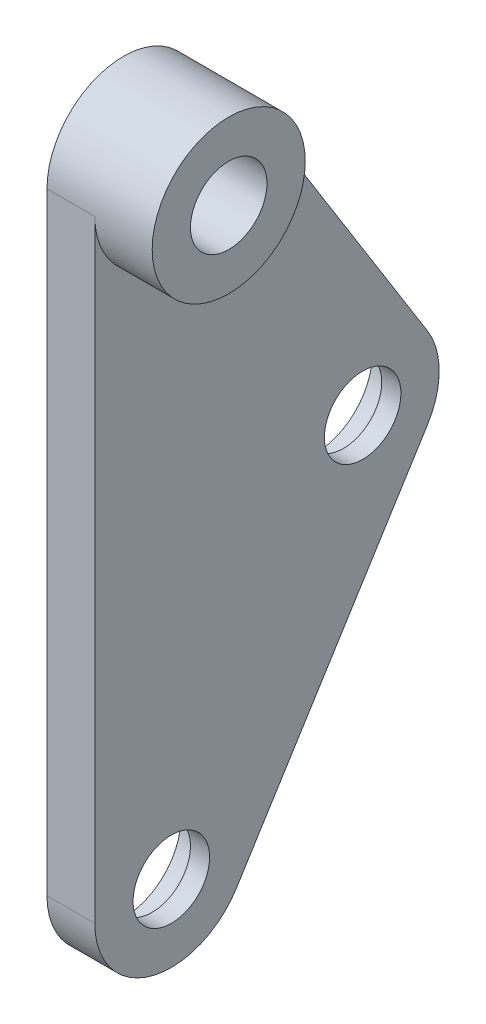
ISO-10303-21;
HEADER;
FILE_DESCRIPTION(('STEP AP214'),'2;1');
FILE_NAME('part.step','',(''),(''),'','','');
FILE_SCHEMA(('AUTOMOTIVE_DESIGN { 1 0 10303 214 1 1 1 1 }'));
ENDSEC;
DATA;
#1=APPLICATION_CONTEXT('core data for automotive mechanical design processes');
#2=APPLICATION_PROTOCOL_DEFINITION('international standard','automotive_design',2000,#1);
#3=PRODUCT_CONTEXT('',#1,'mechanical');
#4=PRODUCT('Part','Part','',(#3));
#5=PRODUCT_RELATED_PRODUCT_CATEGORY('part','',(#4));
#6=PRODUCT_DEFINITION_FORMATION('','',#4);
#7=PRODUCT_DEFINITION_CONTEXT('part definition',#1,'design');
#8=PRODUCT_DEFINITION('design','',#6,#7);
#9=PRODUCT_DEFINITION_SHAPE('','',#8);
#10=(LENGTH_UNIT() NAMED_UNIT(*) SI_UNIT(.MILLI.,.METRE.));
#11=(NAMED_UNIT(*) PLANE_ANGLE_UNIT() SI_UNIT($,.RADIAN.));
#12=(NAMED_UNIT(*) SI_UNIT($,.STERADIAN.) SOLID_ANGLE_UNIT());
#13=UNCERTAINTY_MEASURE_WITH_UNIT(LENGTH_MEASURE(1.E-05),#10,'distance_accuracy_value','');
#14=(GEOMETRIC_REPRESENTATION_CONTEXT(3) GLOBAL_UNCERTAINTY_ASSIGNED_CONTEXT((#13)) GLOBAL_UNIT_ASSIGNED_CONTEXT((#10,
#11,#12)) REPRESENTATION_CONTEXT('',''));
#15=CARTESIAN_POINT('',(0.,0.,0.));
#16=DIRECTION('',(0.,0.,1.));
#17=DIRECTION('',(1.,0.,0.));
#18=AXIS2_PLACEMENT_3D('',#15,#16,#17);
#19=CARTESIAN_POINT('',(5.5,-4.,-4.));
#20=DIRECTION('',(-1.,0.,0.));
#21=DIRECTION('',(0.,0.,1.));
#22=AXIS2_PLACEMENT_3D('',#19,#20,#21);
#23=CYLINDRICAL_SURFACE('',#22,2.);
#24=CARTESIAN_POINT('',(5.5,-4.,-4.));
#25=DIRECTION('',(1.,0.,0.));
#26=DIRECTION('',(0.,0.,-1.));
#27=AXIS2_PLACEMENT_3D('',#24,#25,#26);
#28=CIRCLE('',#27,2.);
#29=CARTESIAN_POINT('',(5.5,-4.,-6.));
#30=VERTEX_POINT('',#29);
#31=EDGE_CURVE('E233',#30,#30,#28,.T.);
#32=ORIENTED_EDGE('',*,*,#31,.T.);
#33=EDGE_LOOP('',(#32));
#34=FACE_BOUND('',#33,.T.);
#35=CARTESIAN_POINT('',(1.5,-4.,-4.));
#36=DIRECTION('',(-1.,0.,0.));
#37=DIRECTION('',(0.,0.,1.));
#38=AXIS2_PLACEMENT_3D('',#35,#36,#37);
#39=CIRCLE('',#38,2.);
#40=CARTESIAN_POINT('',(1.5,-4.,-2.));
#41=VERTEX_POINT('',#40);
#42=EDGE_CURVE('E108',#41,#41,#39,.T.);
#43=ORIENTED_EDGE('',*,*,#42,.T.);
#44=EDGE_LOOP('',(#43));
#45=FACE_BOUND('',#44,.T.);
#46=ADVANCED_FACE('F104',(#34,#45),#23,.F.);
#47=CARTESIAN_POINT('',(5.5,-36.,-4.));
#48=DIRECTION('',(-1.,0.,0.));
#49=DIRECTION('',(0.,0.,1.));
#50=AXIS2_PLACEMENT_3D('',#47,#48,#49);
#51=CYLINDRICAL_SURFACE('',#50,2.);
#52=CARTESIAN_POINT('',(2.5,-36.,-4.));
#53=DIRECTION('',(1.,0.,0.));
#54=DIRECTION('',(0.,0.,-1.));
#55=AXIS2_PLACEMENT_3D('',#52,#53,#54);
#56=CIRCLE('',#55,2.);
#57=CARTESIAN_POINT('',(2.5,-36.,-6.));
#58=VERTEX_POINT('',#57);
#59=EDGE_CURVE('E228',#58,#58,#56,.F.);
#60=ORIENTED_EDGE('',*,*,#59,.F.);
#61=EDGE_LOOP('',(#60));
#62=FACE_BOUND('',#61,.T.);
#63=CARTESIAN_POINT('',(1.5,-36.,-4.));
#64=DIRECTION('',(-1.,0.,0.));
#65=DIRECTION('',(0.,0.,1.));
#66=AXIS2_PLACEMENT_3D('',#63,#64,#65);
#67=CIRCLE('',#66,2.);
#68=CARTESIAN_POINT('',(1.5,-36.,-2.));
#69=VERTEX_POINT('',#68);
#70=EDGE_CURVE('E240',#69,#69,#67,.T.);
#71=ORIENTED_EDGE('',*,*,#70,.T.);
#72=EDGE_LOOP('',(#71));
#73=FACE_BOUND('',#72,.T.);
#74=ADVANCED_FACE('F279',(#62,#73),#51,.F.);
#75=CARTESIAN_POINT('',(5.5,-20.,-14.));
#76=DIRECTION('',(-1.,0.,0.));
#77=DIRECTION('',(0.,0.,1.));
#78=AXIS2_PLACEMENT_3D('',#75,#76,#77);
#79=CYLINDRICAL_SURFACE('',#78,2.);
#80=CARTESIAN_POINT('',(2.5,-20.,-14.));
#81=DIRECTION('',(1.,0.,0.));
#82=DIRECTION('',(0.,0.,-1.));
#83=AXIS2_PLACEMENT_3D('',#80,#81,#82);
#84=CIRCLE('',#83,2.);
#85=CARTESIAN_POINT('',(2.5,-20.,-16.));
#86=VERTEX_POINT('',#85);
#87=EDGE_CURVE('E232',#86,#86,#84,.F.);
#88=ORIENTED_EDGE('',*,*,#87,.F.);
#89=EDGE_LOOP('',(#88));
#90=FACE_BOUND('',#89,.T.);
#91=CARTESIAN_POINT('',(1.5,-20.,-14.));
#92=DIRECTION('',(-1.,0.,0.));
#93=DIRECTION('',(0.,0.,1.));
#94=AXIS2_PLACEMENT_3D('',#91,#92,#93);
#95=CIRCLE('',#94,2.);
#96=CARTESIAN_POINT('',(1.5,-20.,-12.));
#97=VERTEX_POINT('',#96);
#98=EDGE_CURVE('E237',#97,#97,#95,.T.);
#99=ORIENTED_EDGE('',*,*,#98,.T.);
#100=EDGE_LOOP('',(#99));
#101=FACE_BOUND('',#100,.T.);
#102=ADVANCED_FACE('F284',(#90,#101),#79,.F.);
#103=CARTESIAN_POINT('',(2.5,2.79415306338351,-4.47064490141361));
#104=DIRECTION('',(0.,0.52999894000318,-0.847998304005088));
#105=DIRECTION('',(0.,0.847998304005088,0.52999894000318));
#106=AXIS2_PLACEMENT_3D('',#103,#104,#105);
#107=PLANE('',#106);
#108=DIRECTION('',(0.,-0.847998304005088,-0.52999894000318));
#109=VECTOR('',#108,1.);
#110=CARTESIAN_POINT('',(0.,2.79415306338351,-4.47064490141361));
#111=LINE('',#110,#109);
#112=CARTESIAN_POINT('',(0.,-1.88000423998728,-7.39199321602035));
#113=VERTEX_POINT('',#112);
#114=CARTESIAN_POINT('',(0.,-17.8800042399873,-17.3919932160204));
#115=VERTEX_POINT('',#114);
#116=EDGE_CURVE('E196',#113,#115,#111,.T.);
#117=ORIENTED_EDGE('',*,*,#116,.F.);
#118=DIRECTION('',(-1.,0.,0.));
#119=VECTOR('',#118,1.);
#120=CARTESIAN_POINT('',(2.5,-1.88000423998728,-7.39199321602035));
#121=LINE('',#120,#119);
#122=CARTESIAN_POINT('',(2.5,-1.88000423998728,-7.39199321602035));
#123=VERTEX_POINT('',#122);
#124=EDGE_CURVE('E212',#123,#113,#121,.T.);
#125=ORIENTED_EDGE('',*,*,#124,.F.);
#126=DIRECTION('',(0.,-0.847998304005088,-0.52999894000318));
#127=VECTOR('',#126,1.);
#128=CARTESIAN_POINT('',(2.5,2.79415306338351,-4.47064490141361));
#129=LINE('',#128,#127);
#130=CARTESIAN_POINT('',(2.5,-17.8800042399873,-17.3919932160204));
#131=VERTEX_POINT('',#130);
#132=EDGE_CURVE('E187',#123,#131,#129,.T.);
#133=ORIENTED_EDGE('',*,*,#132,.T.);
#134=DIRECTION('',(-1.,0.,0.));
#135=VECTOR('',#134,1.);
#136=CARTESIAN_POINT('',(2.5,-17.8800042399873,-17.3919932160204));
#137=LINE('',#136,#135);
#138=EDGE_CURVE('E115',#131,#115,#137,.T.);
#139=ORIENTED_EDGE('',*,*,#138,.T.);
#140=EDGE_LOOP('',(#117,#125,#133,#139));
#141=FACE_BOUND('',#140,.T.);
#142=ADVANCED_FACE('F292',(#141),#107,.T.);
#143=CARTESIAN_POINT('',(2.5,0.,0.));
#144=DIRECTION('',(0.,0.,-1.));
#145=DIRECTION('',(-1.,0.,0.));
#146=AXIS2_PLACEMENT_3D('',#143,#144,#145);
#147=PLANE('',#146);
#148=DIRECTION('',(0.,-1.,0.));
#149=VECTOR('',#148,1.);
#150=CARTESIAN_POINT('',(0.,0.,0.));
#151=LINE('',#150,#149);
#152=CARTESIAN_POINT('',(0.,-4.,0.));
#153=VERTEX_POINT('',#152);
#154=CARTESIAN_POINT('',(0.,-36.,0.));
#155=VERTEX_POINT('',#154);
#156=EDGE_CURVE('E168',#153,#155,#151,.T.);
#157=ORIENTED_EDGE('',*,*,#156,.T.);
#158=DIRECTION('',(-1.,0.,0.));
#159=VECTOR('',#158,1.);
#160=CARTESIAN_POINT('',(2.5,-36.,0.));
#161=LINE('',#160,#159);
#162=CARTESIAN_POINT('',(2.5,-36.,0.));
#163=VERTEX_POINT('',#162);
#164=EDGE_CURVE('E162',#163,#155,#161,.T.);
#165=ORIENTED_EDGE('',*,*,#164,.F.);
#166=DIRECTION('',(0.,-1.,0.));
#167=VECTOR('',#166,1.);
#168=CARTESIAN_POINT('',(2.5,0.,0.));
#169=LINE('',#168,#167);
#170=CARTESIAN_POINT('',(2.5,-4.,0.));
#171=VERTEX_POINT('',#170);
#172=EDGE_CURVE('E166',#171,#163,#169,.T.);
#173=ORIENTED_EDGE('',*,*,#172,.F.);
#174=DIRECTION('',(-1.,0.,0.));
#175=VECTOR('',#174,1.);
#176=CARTESIAN_POINT('',(2.5,-4.,0.));
#177=LINE('',#176,#175);
#178=EDGE_CURVE('E172',#171,#153,#177,.T.);
#179=ORIENTED_EDGE('',*,*,#178,.T.);
#180=EDGE_LOOP('',(#157,#165,#173,#179));
#181=FACE_BOUND('',#180,.T.);
#182=ADVANCED_FACE('F164',(#181),#147,.F.);
#183=CARTESIAN_POINT('',(2.5,-14.0301081195633,-22.4481729913013));
#184=DIRECTION('',(0.,-0.52999894000318,-0.847998304005088));
#185=DIRECTION('',(0.,0.847998304005088,-0.52999894000318));
#186=AXIS2_PLACEMENT_3D('',#183,#184,#185);
#187=PLANE('',#186);
#188=DIRECTION('',(0.,-0.847998304005088,0.52999894000318));
#189=VECTOR('',#188,1.);
#190=CARTESIAN_POINT('',(0.,-14.0301081195633,-22.4481729913013));
#191=LINE('',#190,#189);
#192=CARTESIAN_POINT('',(0.,-22.1199957600127,-17.3919932160204));
#193=VERTEX_POINT('',#192);
#194=CARTESIAN_POINT('',(0.,-38.1199957600127,-7.39199321602035));
#195=VERTEX_POINT('',#194);
#196=EDGE_CURVE('E193',#193,#195,#191,.T.);
#197=ORIENTED_EDGE('',*,*,#196,.F.);
#198=DIRECTION('',(-1.,0.,0.));
#199=VECTOR('',#198,1.);
#200=CARTESIAN_POINT('',(2.5,-22.1199957600127,-17.3919932160204));
#201=LINE('',#200,#199);
#202=CARTESIAN_POINT('',(2.5,-22.1199957600127,-17.3919932160204));
#203=VERTEX_POINT('',#202);
#204=EDGE_CURVE('E124',#203,#193,#201,.T.);
#205=ORIENTED_EDGE('',*,*,#204,.F.);
#206=DIRECTION('',(0.,-0.847998304005088,0.52999894000318));
#207=VECTOR('',#206,1.);
#208=CARTESIAN_POINT('',(2.5,-14.0301081195633,-22.4481729913013));
#209=LINE('',#208,#207);
#210=CARTESIAN_POINT('',(2.5,-38.1199957600127,-7.39199321602035));
#211=VERTEX_POINT('',#210);
#212=EDGE_CURVE('E186',#203,#211,#209,.T.);
#213=ORIENTED_EDGE('',*,*,#212,.T.);
#214=DIRECTION('',(-1.,0.,0.));
#215=VECTOR('',#214,1.);
#216=CARTESIAN_POINT('',(2.5,-38.1199957600127,-7.39199321602035));
#217=LINE('',#216,#215);
#218=EDGE_CURVE('E145',#211,#195,#217,.T.);
#219=ORIENTED_EDGE('',*,*,#218,.T.);
#220=EDGE_LOOP('',(#197,#205,#213,#219));
#221=FACE_BOUND('',#220,.T.);
#222=ADVANCED_FACE('F301',(#221),#187,.T.);
#223=CARTESIAN_POINT('',(0.,0.,0.));
#224=DIRECTION('',(1.,0.,0.));
#225=DIRECTION('',(0.,0.,-1.));
#226=AXIS2_PLACEMENT_3D('',#223,#224,#225);
#227=PLANE('',#226);
#228=CARTESIAN_POINT('',(0.,-4.,-4.));
#229=DIRECTION('',(-1.,0.,0.));
#230=DIRECTION('',(0.,0.,1.));
#231=AXIS2_PLACEMENT_3D('',#228,#229,#230);
#232=CIRCLE('',#231,3.);
#233=CARTESIAN_POINT('',(0.,-4.,-1.));
#234=VERTEX_POINT('',#233);
#235=EDGE_CURVE('E433',#234,#234,#232,.T.);
#236=ORIENTED_EDGE('',*,*,#235,.F.);
#237=EDGE_LOOP('',(#236));
#238=FACE_BOUND('',#237,.T.);
#239=CARTESIAN_POINT('',(0.,-20.,-14.));
#240=DIRECTION('',(-1.,0.,0.));
#241=DIRECTION('',(0.,0.,1.));
#242=AXIS2_PLACEMENT_3D('',#239,#240,#241);
#243=CIRCLE('',#242,3.);
#244=CARTESIAN_POINT('',(0.,-20.,-11.));
#245=VERTEX_POINT('',#244);
#246=EDGE_CURVE('E443',#245,#245,#243,.T.);
#247=ORIENTED_EDGE('',*,*,#246,.F.);
#248=EDGE_LOOP('',(#247));
#249=FACE_BOUND('',#248,.T.);
#250=CARTESIAN_POINT('',(0.,-36.,-4.));
#251=DIRECTION('',(-1.,0.,0.));
#252=DIRECTION('',(0.,0.,1.));
#253=AXIS2_PLACEMENT_3D('',#250,#251,#252);
#254=CIRCLE('',#253,3.);
#255=CARTESIAN_POINT('',(0.,-36.,-1.));
#256=VERTEX_POINT('',#255);
#257=EDGE_CURVE('E257',#256,#256,#254,.T.);
#258=ORIENTED_EDGE('',*,*,#257,.F.);
#259=EDGE_LOOP('',(#258));
#260=FACE_BOUND('',#259,.T.);
#261=ORIENTED_EDGE('',*,*,#116,.T.);
#262=CARTESIAN_POINT('',(0.,-20.,-14.));
#263=DIRECTION('',(1.,0.,0.));
#264=DIRECTION('',(0.,0.,-1.));
#265=AXIS2_PLACEMENT_3D('',#262,#263,#264);
#266=CIRCLE('',#265,4.);
#267=EDGE_CURVE('E179',#193,#115,#266,.T.);
#268=ORIENTED_EDGE('',*,*,#267,.F.);
#269=ORIENTED_EDGE('',*,*,#196,.T.);
#270=CARTESIAN_POINT('',(0.,-36.,-4.));
#271=DIRECTION('',(1.,0.,0.));
#272=DIRECTION('',(0.,0.,-1.));
#273=AXIS2_PLACEMENT_3D('',#270,#271,#272);
#274=CIRCLE('',#273,4.);
#275=EDGE_CURVE('E180',#155,#195,#274,.T.);
#276=ORIENTED_EDGE('',*,*,#275,.F.);
#277=ORIENTED_EDGE('',*,*,#156,.F.);
#278=CARTESIAN_POINT('',(0.,-4.,-4.));
#279=DIRECTION('',(1.,0.,0.));
#280=DIRECTION('',(0.,0.,-1.));
#281=AXIS2_PLACEMENT_3D('',#278,#279,#280);
#282=CIRCLE('',#281,4.);
#283=EDGE_CURVE('E200',#113,#153,#282,.T.);
#284=ORIENTED_EDGE('',*,*,#283,.F.);
#285=EDGE_LOOP('',(#261,#268,#269,#276,#277,#284));
#286=FACE_BOUND('',#285,.T.);
#287=ADVANCED_FACE('F297',(#238,#249,#260,#286),#227,.F.);
#288=CARTESIAN_POINT('',(2.5,0.,0.));
#289=DIRECTION('',(1.,0.,0.));
#290=DIRECTION('',(0.,0.,-1.));
#291=AXIS2_PLACEMENT_3D('',#288,#289,#290);
#292=PLANE('',#291);
#293=ORIENTED_EDGE('',*,*,#87,.T.);
#294=EDGE_LOOP('',(#293));
#295=FACE_BOUND('',#294,.T.);
#296=ORIENTED_EDGE('',*,*,#59,.T.);
#297=EDGE_LOOP('',(#296));
#298=FACE_BOUND('',#297,.T.);
#299=CARTESIAN_POINT('',(2.5,-4.,-4.));
#300=DIRECTION('',(1.,0.,0.));
#301=DIRECTION('',(0.,0.,-1.));
#302=AXIS2_PLACEMENT_3D('',#299,#300,#301);
#303=CIRCLE('',#302,4.);
#304=EDGE_CURVE('E12',#171,#123,#303,.T.);
#305=ORIENTED_EDGE('',*,*,#304,.F.);
#306=ORIENTED_EDGE('',*,*,#172,.T.);
#307=CARTESIAN_POINT('',(2.5,-36.,-4.));
#308=DIRECTION('',(1.,0.,0.));
#309=DIRECTION('',(0.,0.,-1.));
#310=AXIS2_PLACEMENT_3D('',#307,#308,#309);
#311=CIRCLE('',#310,4.);
#312=EDGE_CURVE('E175',#163,#211,#311,.T.);
#313=ORIENTED_EDGE('',*,*,#312,.T.);
#314=ORIENTED_EDGE('',*,*,#212,.F.);
#315=CARTESIAN_POINT('',(2.5,-20.,-14.));
#316=DIRECTION('',(1.,0.,0.));
#317=DIRECTION('',(0.,0.,-1.));
#318=AXIS2_PLACEMENT_3D('',#315,#316,#317);
#319=CIRCLE('',#318,4.);
#320=EDGE_CURVE('E220',#203,#131,#319,.T.);
#321=ORIENTED_EDGE('',*,*,#320,.T.);
#322=ORIENTED_EDGE('',*,*,#132,.F.);
#323=EDGE_LOOP('',(#305,#306,#313,#314,#321,#322));
#324=FACE_BOUND('',#323,.T.);
#325=ADVANCED_FACE('F182',(#295,#298,#324),#292,.T.);
#326=CARTESIAN_POINT('',(2.5,-36.,-4.));
#327=DIRECTION('',(-1.,0.,0.));
#328=DIRECTION('',(0.,0.,1.));
#329=AXIS2_PLACEMENT_3D('',#326,#327,#328);
#330=CYLINDRICAL_SURFACE('',#329,4.);
#331=ORIENTED_EDGE('',*,*,#312,.F.);
#332=ORIENTED_EDGE('',*,*,#164,.T.);
#333=ORIENTED_EDGE('',*,*,#275,.T.);
#334=ORIENTED_EDGE('',*,*,#218,.F.);
#335=EDGE_LOOP('',(#331,#332,#333,#334));
#336=FACE_BOUND('',#335,.T.);
#337=ADVANCED_FACE('F106',(#336),#330,.T.);
#338=CARTESIAN_POINT('',(2.5,-20.,-14.));
#339=DIRECTION('',(-1.,0.,0.));
#340=DIRECTION('',(0.,0.,1.));
#341=AXIS2_PLACEMENT_3D('',#338,#339,#340);
#342=CYLINDRICAL_SURFACE('',#341,4.);
#343=ORIENTED_EDGE('',*,*,#267,.T.);
#344=ORIENTED_EDGE('',*,*,#138,.F.);
#345=ORIENTED_EDGE('',*,*,#320,.F.);
#346=ORIENTED_EDGE('',*,*,#204,.T.);
#347=EDGE_LOOP('',(#343,#344,#345,#346));
#348=FACE_BOUND('',#347,.T.);
#349=ADVANCED_FACE('F267',(#348),#342,.T.);
#350=CARTESIAN_POINT('',(2.5,-4.,-4.));
#351=DIRECTION('',(-1.,0.,0.));
#352=DIRECTION('',(0.,0.,1.));
#353=AXIS2_PLACEMENT_3D('',#350,#351,#352);
#354=CYLINDRICAL_SURFACE('',#353,4.);
#355=ORIENTED_EDGE('',*,*,#178,.F.);
#356=ORIENTED_EDGE('',*,*,#304,.T.);
#357=ORIENTED_EDGE('',*,*,#124,.T.);
#358=ORIENTED_EDGE('',*,*,#283,.T.);
#359=EDGE_LOOP('',(#355,#356,#357,#358));
#360=FACE_BOUND('',#359,.T.);
#361=CARTESIAN_POINT('',(5.5,-4.,-4.));
#362=DIRECTION('',(1.,0.,0.));
#363=DIRECTION('',(0.,0.,-1.));
#364=AXIS2_PLACEMENT_3D('',#361,#362,#363);
#365=CIRCLE('',#364,4.);
#366=CARTESIAN_POINT('',(5.5,-4.,-8.));
#367=VERTEX_POINT('',#366);
#368=EDGE_CURVE('E227',#367,#367,#365,.T.);
#369=ORIENTED_EDGE('',*,*,#368,.F.);
#370=EDGE_LOOP('',(#369));
#371=FACE_BOUND('',#370,.T.);
#372=ADVANCED_FACE('F265',(#360,#371),#354,.T.);
#373=CARTESIAN_POINT('',(5.5,-4.,-4.));
#374=DIRECTION('',(1.,0.,0.));
#375=DIRECTION('',(0.,0.,-1.));
#376=AXIS2_PLACEMENT_3D('',#373,#374,#375);
#377=PLANE('',#376);
#378=ORIENTED_EDGE('',*,*,#31,.F.);
#379=EDGE_LOOP('',(#378));
#380=FACE_BOUND('',#379,.T.);
#381=ORIENTED_EDGE('',*,*,#368,.T.);
#382=EDGE_LOOP('',(#381));
#383=FACE_BOUND('',#382,.T.);
#384=ADVANCED_FACE('F263',(#380,#383),#377,.T.);
#385=CARTESIAN_POINT('',(1.5,-20.,-14.));
#386=DIRECTION('',(-1.,0.,0.));
#387=DIRECTION('',(0.,0.,1.));
#388=AXIS2_PLACEMENT_3D('',#385,#386,#387);
#389=CYLINDRICAL_SURFACE('',#388,3.);
#390=CARTESIAN_POINT('',(1.5,-20.,-14.));
#391=DIRECTION('',(-1.,0.,0.));
#392=DIRECTION('',(0.,0.,1.));
#393=AXIS2_PLACEMENT_3D('',#390,#391,#392);
#394=CIRCLE('',#393,3.);
#395=CARTESIAN_POINT('',(1.5,-20.,-11.));
#396=VERTEX_POINT('',#395);
#397=EDGE_CURVE('E437',#396,#396,#394,.T.);
#398=ORIENTED_EDGE('',*,*,#397,.F.);
#399=EDGE_LOOP('',(#398));
#400=FACE_BOUND('',#399,.T.);
#401=ORIENTED_EDGE('',*,*,#246,.T.);
#402=EDGE_LOOP('',(#401));
#403=FACE_BOUND('',#402,.T.);
#404=ADVANCED_FACE('F274',(#400,#403),#389,.F.);
#405=CARTESIAN_POINT('',(1.5,-20.,-14.));
#406=DIRECTION('',(-1.,0.,0.));
#407=DIRECTION('',(0.,0.,1.));
#408=AXIS2_PLACEMENT_3D('',#405,#406,#407);
#409=PLANE('',#408);
#410=ORIENTED_EDGE('',*,*,#98,.F.);
#411=EDGE_LOOP('',(#410));
#412=FACE_BOUND('',#411,.T.);
#413=ORIENTED_EDGE('',*,*,#397,.T.);
#414=EDGE_LOOP('',(#413));
#415=FACE_BOUND('',#414,.T.);
#416=ADVANCED_FACE('F378',(#412,#415),#409,.T.);
#417=CARTESIAN_POINT('',(1.5,-36.,-4.));
#418=DIRECTION('',(-1.,0.,0.));
#419=DIRECTION('',(0.,0.,1.));
#420=AXIS2_PLACEMENT_3D('',#417,#418,#419);
#421=CYLINDRICAL_SURFACE('',#420,3.);
#422=CARTESIAN_POINT('',(1.5,-36.,-4.));
#423=DIRECTION('',(-1.,0.,0.));
#424=DIRECTION('',(0.,0.,1.));
#425=AXIS2_PLACEMENT_3D('',#422,#423,#424);
#426=CIRCLE('',#425,3.);
#427=CARTESIAN_POINT('',(1.5,-36.,-1.));
#428=VERTEX_POINT('',#427);
#429=EDGE_CURVE('E446',#428,#428,#426,.T.);
#430=ORIENTED_EDGE('',*,*,#429,.F.);
#431=EDGE_LOOP('',(#430));
#432=FACE_BOUND('',#431,.T.);
#433=ORIENTED_EDGE('',*,*,#257,.T.);
#434=EDGE_LOOP('',(#433));
#435=FACE_BOUND('',#434,.T.);
#436=ADVANCED_FACE('F289',(#432,#435),#421,.F.);
#437=CARTESIAN_POINT('',(1.5,-36.,-4.));
#438=DIRECTION('',(-1.,0.,0.));
#439=DIRECTION('',(0.,0.,1.));
#440=AXIS2_PLACEMENT_3D('',#437,#438,#439);
#441=PLANE('',#440);
#442=ORIENTED_EDGE('',*,*,#70,.F.);
#443=EDGE_LOOP('',(#442));
#444=FACE_BOUND('',#443,.T.);
#445=ORIENTED_EDGE('',*,*,#429,.T.);
#446=EDGE_LOOP('',(#445));
#447=FACE_BOUND('',#446,.T.);
#448=ADVANCED_FACE('F395',(#444,#447),#441,.T.);
#449=CARTESIAN_POINT('',(1.5,-4.,-4.));
#450=DIRECTION('',(-1.,0.,0.));
#451=DIRECTION('',(0.,0.,1.));
#452=AXIS2_PLACEMENT_3D('',#449,#450,#451);
#453=CYLINDRICAL_SURFACE('',#452,3.);
#454=CARTESIAN_POINT('',(1.5,-4.,-4.));
#455=DIRECTION('',(-1.,0.,0.));
#456=DIRECTION('',(0.,0.,1.));
#457=AXIS2_PLACEMENT_3D('',#454,#455,#456);
#458=CIRCLE('',#457,3.);
#459=CARTESIAN_POINT('',(1.5,-4.,-1.));
#460=VERTEX_POINT('',#459);
#461=EDGE_CURVE('E241',#460,#460,#458,.T.);
#462=ORIENTED_EDGE('',*,*,#461,.F.);
#463=EDGE_LOOP('',(#462));
#464=FACE_BOUND('',#463,.T.);
#465=ORIENTED_EDGE('',*,*,#235,.T.);
#466=EDGE_LOOP('',(#465));
#467=FACE_BOUND('',#466,.T.);
#468=ADVANCED_FACE('F403',(#464,#467),#453,.F.);
#469=CARTESIAN_POINT('',(1.5,-4.,-4.));
#470=DIRECTION('',(-1.,0.,0.));
#471=DIRECTION('',(0.,0.,1.));
#472=AXIS2_PLACEMENT_3D('',#469,#470,#471);
#473=PLANE('',#472);
#474=ORIENTED_EDGE('',*,*,#42,.F.);
#475=EDGE_LOOP('',(#474));
#476=FACE_BOUND('',#475,.T.);
#477=ORIENTED_EDGE('',*,*,#461,.T.);
#478=EDGE_LOOP('',(#477));
#479=FACE_BOUND('',#478,.T.);
#480=ADVANCED_FACE('F411',(#476,#479),#473,.T.);
#481=CLOSED_SHELL('',(#46,#74,#102,#142,#182,#222,#287,#325,#337,#349,#372,#384,#404,#416,#436,
#448,#468,#480));
#482=MANIFOLD_SOLID_BREP('B2',#481);
#483=ADVANCED_BREP_SHAPE_REPRESENTATION('',(#18,#482),#14);
#484=SHAPE_DEFINITION_REPRESENTATION(#9,#483);
ENDSEC;
END-ISO-10303-21;
